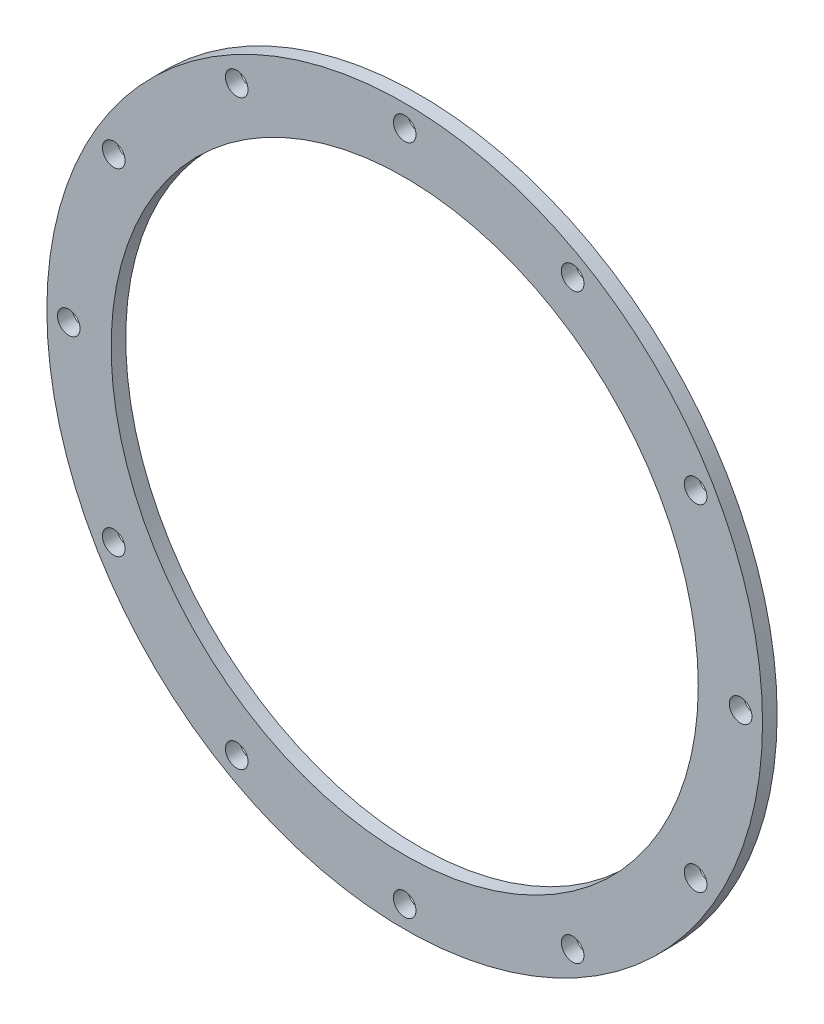
ISO-10303-21;
HEADER;
FILE_DESCRIPTION(('STEP AP214'),'2;1');
FILE_NAME('part.step','',(''),(''),'','','');
FILE_SCHEMA(('AUTOMOTIVE_DESIGN { 1 0 10303 214 1 1 1 1 }'));
ENDSEC;
DATA;
#1=APPLICATION_CONTEXT('core data for automotive mechanical design processes');
#2=APPLICATION_PROTOCOL_DEFINITION('international standard','automotive_design',2000,#1);
#3=PRODUCT_CONTEXT('',#1,'mechanical');
#4=PRODUCT('Part','Part','',(#3));
#5=PRODUCT_RELATED_PRODUCT_CATEGORY('part','',(#4));
#6=PRODUCT_DEFINITION_FORMATION('','',#4);
#7=PRODUCT_DEFINITION_CONTEXT('part definition',#1,'design');
#8=PRODUCT_DEFINITION('design','',#6,#7);
#9=PRODUCT_DEFINITION_SHAPE('','',#8);
#10=(LENGTH_UNIT() NAMED_UNIT(*) SI_UNIT(.MILLI.,.METRE.));
#11=(NAMED_UNIT(*) PLANE_ANGLE_UNIT() SI_UNIT($,.RADIAN.));
#12=(NAMED_UNIT(*) SI_UNIT($,.STERADIAN.) SOLID_ANGLE_UNIT());
#13=UNCERTAINTY_MEASURE_WITH_UNIT(LENGTH_MEASURE(1.E-05),#10,'distance_accuracy_value','');
#14=(GEOMETRIC_REPRESENTATION_CONTEXT(3) GLOBAL_UNCERTAINTY_ASSIGNED_CONTEXT((#13)) GLOBAL_UNIT_ASSIGNED_CONTEXT((#10,
#11,#12)) REPRESENTATION_CONTEXT('',''));
#15=CARTESIAN_POINT('',(0.,0.,0.));
#16=DIRECTION('',(0.,0.,1.));
#17=DIRECTION('',(1.,0.,0.));
#18=AXIS2_PLACEMENT_3D('',#15,#16,#17);
#19=CARTESIAN_POINT('',(0.,0.,2.));
#20=DIRECTION('',(0.,0.,1.));
#21=DIRECTION('',(1.,0.,0.));
#22=AXIS2_PLACEMENT_3D('',#19,#20,#21);
#23=PLANE('',#22);
#24=CARTESIAN_POINT('',(-39.8371685740822,23.0000000000035,2.));
#25=DIRECTION('',(0.,0.,1.));
#26=DIRECTION('',(1.,0.,0.));
#27=AXIS2_PLACEMENT_3D('',#24,#25,#26);
#28=CIRCLE('',#27,1.55);
#29=CARTESIAN_POINT('',(-38.2871685740822,23.0000000000035,2.));
#30=VERTEX_POINT('',#29);
#31=EDGE_CURVE('E110',#30,#30,#28,.T.);
#32=ORIENTED_EDGE('',*,*,#31,.F.);
#33=EDGE_LOOP('',(#32));
#34=FACE_BOUND('',#33,.T.);
#35=CARTESIAN_POINT('',(-39.8371685740858,-22.9999999999972,2.));
#36=DIRECTION('',(0.,0.,1.));
#37=DIRECTION('',(1.,0.,0.));
#38=AXIS2_PLACEMENT_3D('',#35,#36,#37);
#39=CIRCLE('',#38,1.54999999999999);
#40=CARTESIAN_POINT('',(-38.2871685740858,-22.9999999999972,2.));
#41=VERTEX_POINT('',#40);
#42=EDGE_CURVE('E98',#41,#41,#39,.T.);
#43=ORIENTED_EDGE('',*,*,#42,.F.);
#44=EDGE_LOOP('',(#43));
#45=FACE_BOUND('',#44,.T.);
#46=CARTESIAN_POINT('',(-2.44549283010593E-12,-46.,2.));
#47=DIRECTION('',(0.,0.,1.));
#48=DIRECTION('',(1.,0.,0.));
#49=AXIS2_PLACEMENT_3D('',#46,#47,#48);
#50=CIRCLE('',#49,1.55);
#51=CARTESIAN_POINT('',(1.54999999999756,-46.,2.));
#52=VERTEX_POINT('',#51);
#53=EDGE_CURVE('E86',#52,#52,#50,.T.);
#54=ORIENTED_EDGE('',*,*,#53,.F.);
#55=EDGE_LOOP('',(#54));
#56=FACE_BOUND('',#55,.T.);
#57=CARTESIAN_POINT('',(39.8371685740834,-23.0000000000014,2.));
#58=DIRECTION('',(0.,0.,1.));
#59=DIRECTION('',(1.,0.,0.));
#60=AXIS2_PLACEMENT_3D('',#57,#58,#59);
#61=CIRCLE('',#60,1.55);
#62=CARTESIAN_POINT('',(41.3871685740834,-23.0000000000014,2.));
#63=VERTEX_POINT('',#62);
#64=EDGE_CURVE('E74',#63,#63,#61,.T.);
#65=ORIENTED_EDGE('',*,*,#64,.F.);
#66=EDGE_LOOP('',(#65));
#67=FACE_BOUND('',#66,.T.);
#68=CARTESIAN_POINT('',(39.8371685740846,22.9999999999993,2.));
#69=DIRECTION('',(0.,0.,1.));
#70=DIRECTION('',(1.,0.,0.));
#71=AXIS2_PLACEMENT_3D('',#68,#69,#70);
#72=CIRCLE('',#71,1.55);
#73=CARTESIAN_POINT('',(41.3871685740846,22.9999999999993,2.));
#74=VERTEX_POINT('',#73);
#75=EDGE_CURVE('E62',#74,#74,#72,.T.);
#76=ORIENTED_EDGE('',*,*,#75,.F.);
#77=EDGE_LOOP('',(#76));
#78=FACE_BOUND('',#77,.T.);
#79=CARTESIAN_POINT('',(0.,46.,2.));
#80=DIRECTION('',(0.,0.,1.));
#81=DIRECTION('',(1.,0.,0.));
#82=AXIS2_PLACEMENT_3D('',#79,#80,#81);
#83=CIRCLE('',#82,1.55);
#84=CARTESIAN_POINT('',(1.55,46.,2.));
#85=VERTEX_POINT('',#84);
#86=EDGE_CURVE('E50',#85,#85,#83,.T.);
#87=ORIENTED_EDGE('',*,*,#86,.F.);
#88=EDGE_LOOP('',(#87));
#89=FACE_BOUND('',#88,.T.);
#90=CARTESIAN_POINT('',(0.,0.,2.));
#91=DIRECTION('',(0.,0.,1.));
#92=DIRECTION('',(1.,0.,0.));
#93=AXIS2_PLACEMENT_3D('',#90,#91,#92);
#94=CIRCLE('',#93,49.);
#95=CARTESIAN_POINT('',(49.,0.,2.));
#96=VERTEX_POINT('',#95);
#97=EDGE_CURVE('E10',#96,#96,#94,.T.);
#98=ORIENTED_EDGE('',*,*,#97,.T.);
#99=EDGE_LOOP('',(#98));
#100=FACE_BOUND('',#99,.T.);
#101=CARTESIAN_POINT('',(0.,0.,2.));
#102=DIRECTION('',(0.,0.,1.));
#103=DIRECTION('',(1.,0.,0.));
#104=AXIS2_PLACEMENT_3D('',#101,#102,#103);
#105=CIRCLE('',#104,40.2);
#106=CARTESIAN_POINT('',(40.2,0.,2.));
#107=VERTEX_POINT('',#106);
#108=EDGE_CURVE('E45',#107,#107,#105,.T.);
#109=ORIENTED_EDGE('',*,*,#108,.F.);
#110=EDGE_LOOP('',(#109));
#111=FACE_BOUND('',#110,.T.);
#112=CARTESIAN_POINT('',(23.0000000000004,39.837168574084,2.));
#113=DIRECTION('',(0.,0.,1.));
#114=DIRECTION('',(1.,0.,0.));
#115=AXIS2_PLACEMENT_3D('',#112,#113,#114);
#116=CIRCLE('',#115,1.55);
#117=CARTESIAN_POINT('',(24.5500000000004,39.837168574084,2.));
#118=VERTEX_POINT('',#117);
#119=EDGE_CURVE('E56',#118,#118,#116,.T.);
#120=ORIENTED_EDGE('',*,*,#119,.F.);
#121=EDGE_LOOP('',(#120));
#122=FACE_BOUND('',#121,.T.);
#123=CARTESIAN_POINT('',(46.,-1.22298005056365E-12,2.));
#124=DIRECTION('',(0.,0.,1.));
#125=DIRECTION('',(1.,0.,0.));
#126=AXIS2_PLACEMENT_3D('',#123,#124,#125);
#127=CIRCLE('',#126,1.55);
#128=CARTESIAN_POINT('',(47.55,-1.22298005056365E-12,2.));
#129=VERTEX_POINT('',#128);
#130=EDGE_CURVE('E68',#129,#129,#127,.T.);
#131=ORIENTED_EDGE('',*,*,#130,.F.);
#132=EDGE_LOOP('',(#131));
#133=FACE_BOUND('',#132,.T.);
#134=CARTESIAN_POINT('',(22.9999999999982,-39.8371685740852,2.));
#135=DIRECTION('',(0.,0.,1.));
#136=DIRECTION('',(1.,0.,0.));
#137=AXIS2_PLACEMENT_3D('',#134,#135,#136);
#138=CIRCLE('',#137,1.55);
#139=CARTESIAN_POINT('',(24.5499999999982,-39.8371685740852,2.));
#140=VERTEX_POINT('',#139);
#141=EDGE_CURVE('E80',#140,#140,#138,.T.);
#142=ORIENTED_EDGE('',*,*,#141,.F.);
#143=EDGE_LOOP('',(#142));
#144=FACE_BOUND('',#143,.T.);
#145=CARTESIAN_POINT('',(-23.0000000000025,-39.8371685740828,2.));
#146=DIRECTION('',(0.,0.,1.));
#147=DIRECTION('',(1.,0.,0.));
#148=AXIS2_PLACEMENT_3D('',#145,#146,#147);
#149=CIRCLE('',#148,1.55);
#150=CARTESIAN_POINT('',(-21.4500000000025,-39.8371685740828,2.));
#151=VERTEX_POINT('',#150);
#152=EDGE_CURVE('E92',#151,#151,#149,.T.);
#153=ORIENTED_EDGE('',*,*,#152,.F.);
#154=EDGE_LOOP('',(#153));
#155=FACE_BOUND('',#154,.T.);
#156=CARTESIAN_POINT('',(-46.,3.66894015169095E-12,2.));
#157=DIRECTION('',(0.,0.,1.));
#158=DIRECTION('',(1.,0.,0.));
#159=AXIS2_PLACEMENT_3D('',#156,#157,#158);
#160=CIRCLE('',#159,1.55);
#161=CARTESIAN_POINT('',(-44.45,3.66894015169095E-12,2.));
#162=VERTEX_POINT('',#161);
#163=EDGE_CURVE('E104',#162,#162,#160,.T.);
#164=ORIENTED_EDGE('',*,*,#163,.F.);
#165=EDGE_LOOP('',(#164));
#166=FACE_BOUND('',#165,.T.);
#167=CARTESIAN_POINT('',(-22.9999999999961,39.8371685740864,2.));
#168=DIRECTION('',(0.,0.,1.));
#169=DIRECTION('',(1.,0.,0.));
#170=AXIS2_PLACEMENT_3D('',#167,#168,#169);
#171=CIRCLE('',#170,1.55);
#172=CARTESIAN_POINT('',(-21.4499999999961,39.8371685740864,2.));
#173=VERTEX_POINT('',#172);
#174=EDGE_CURVE('E116',#173,#173,#171,.T.);
#175=ORIENTED_EDGE('',*,*,#174,.F.);
#176=EDGE_LOOP('',(#175));
#177=FACE_BOUND('',#176,.T.);
#178=ADVANCED_FACE('F34',(#34,#45,#56,#67,#78,#89,#100,#111,#122,#133,#144,#155,#166,#177),#23,.T.);
#179=CARTESIAN_POINT('',(0.,0.,0.));
#180=DIRECTION('',(0.,0.,1.));
#181=DIRECTION('',(1.,0.,0.));
#182=AXIS2_PLACEMENT_3D('',#179,#180,#181);
#183=PLANE('',#182);
#184=CARTESIAN_POINT('',(0.,0.,0.));
#185=DIRECTION('',(0.,0.,1.));
#186=DIRECTION('',(1.,0.,0.));
#187=AXIS2_PLACEMENT_3D('',#184,#185,#186);
#188=CIRCLE('',#187,49.);
#189=CARTESIAN_POINT('',(49.,0.,0.));
#190=VERTEX_POINT('',#189);
#191=EDGE_CURVE('E38',#190,#190,#188,.T.);
#192=ORIENTED_EDGE('',*,*,#191,.F.);
#193=EDGE_LOOP('',(#192));
#194=FACE_BOUND('',#193,.T.);
#195=CARTESIAN_POINT('',(0.,0.,0.));
#196=DIRECTION('',(0.,0.,1.));
#197=DIRECTION('',(1.,0.,0.));
#198=AXIS2_PLACEMENT_3D('',#195,#196,#197);
#199=CIRCLE('',#198,40.2);
#200=CARTESIAN_POINT('',(40.2,0.,0.));
#201=VERTEX_POINT('',#200);
#202=EDGE_CURVE('E47',#201,#201,#199,.T.);
#203=ORIENTED_EDGE('',*,*,#202,.T.);
#204=EDGE_LOOP('',(#203));
#205=FACE_BOUND('',#204,.T.);
#206=CARTESIAN_POINT('',(0.,46.,0.));
#207=DIRECTION('',(0.,0.,1.));
#208=DIRECTION('',(1.,0.,0.));
#209=AXIS2_PLACEMENT_3D('',#206,#207,#208);
#210=CIRCLE('',#209,1.55);
#211=CARTESIAN_POINT('',(1.55,46.,0.));
#212=VERTEX_POINT('',#211);
#213=EDGE_CURVE('E53',#212,#212,#210,.T.);
#214=ORIENTED_EDGE('',*,*,#213,.T.);
#215=EDGE_LOOP('',(#214));
#216=FACE_BOUND('',#215,.T.);
#217=CARTESIAN_POINT('',(23.0000000000004,39.837168574084,0.));
#218=DIRECTION('',(0.,0.,1.));
#219=DIRECTION('',(1.,0.,0.));
#220=AXIS2_PLACEMENT_3D('',#217,#218,#219);
#221=CIRCLE('',#220,1.55);
#222=CARTESIAN_POINT('',(24.5500000000004,39.837168574084,0.));
#223=VERTEX_POINT('',#222);
#224=EDGE_CURVE('E59',#223,#223,#221,.T.);
#225=ORIENTED_EDGE('',*,*,#224,.T.);
#226=EDGE_LOOP('',(#225));
#227=FACE_BOUND('',#226,.T.);
#228=CARTESIAN_POINT('',(39.8371685740846,22.9999999999993,0.));
#229=DIRECTION('',(0.,0.,1.));
#230=DIRECTION('',(1.,0.,0.));
#231=AXIS2_PLACEMENT_3D('',#228,#229,#230);
#232=CIRCLE('',#231,1.55);
#233=CARTESIAN_POINT('',(41.3871685740846,22.9999999999993,0.));
#234=VERTEX_POINT('',#233);
#235=EDGE_CURVE('E65',#234,#234,#232,.T.);
#236=ORIENTED_EDGE('',*,*,#235,.T.);
#237=EDGE_LOOP('',(#236));
#238=FACE_BOUND('',#237,.T.);
#239=CARTESIAN_POINT('',(46.,-1.22298005056365E-12,0.));
#240=DIRECTION('',(0.,0.,1.));
#241=DIRECTION('',(1.,0.,0.));
#242=AXIS2_PLACEMENT_3D('',#239,#240,#241);
#243=CIRCLE('',#242,1.55);
#244=CARTESIAN_POINT('',(47.55,-1.22298005056365E-12,0.));
#245=VERTEX_POINT('',#244);
#246=EDGE_CURVE('E71',#245,#245,#243,.T.);
#247=ORIENTED_EDGE('',*,*,#246,.T.);
#248=EDGE_LOOP('',(#247));
#249=FACE_BOUND('',#248,.T.);
#250=CARTESIAN_POINT('',(39.8371685740834,-23.0000000000014,0.));
#251=DIRECTION('',(0.,0.,1.));
#252=DIRECTION('',(1.,0.,0.));
#253=AXIS2_PLACEMENT_3D('',#250,#251,#252);
#254=CIRCLE('',#253,1.55);
#255=CARTESIAN_POINT('',(41.3871685740834,-23.0000000000014,0.));
#256=VERTEX_POINT('',#255);
#257=EDGE_CURVE('E77',#256,#256,#254,.T.);
#258=ORIENTED_EDGE('',*,*,#257,.T.);
#259=EDGE_LOOP('',(#258));
#260=FACE_BOUND('',#259,.T.);
#261=CARTESIAN_POINT('',(22.9999999999982,-39.8371685740852,0.));
#262=DIRECTION('',(0.,0.,1.));
#263=DIRECTION('',(1.,0.,0.));
#264=AXIS2_PLACEMENT_3D('',#261,#262,#263);
#265=CIRCLE('',#264,1.55);
#266=CARTESIAN_POINT('',(24.5499999999982,-39.8371685740852,0.));
#267=VERTEX_POINT('',#266);
#268=EDGE_CURVE('E83',#267,#267,#265,.T.);
#269=ORIENTED_EDGE('',*,*,#268,.T.);
#270=EDGE_LOOP('',(#269));
#271=FACE_BOUND('',#270,.T.);
#272=CARTESIAN_POINT('',(-2.44549283010593E-12,-46.,0.));
#273=DIRECTION('',(0.,0.,1.));
#274=DIRECTION('',(1.,0.,0.));
#275=AXIS2_PLACEMENT_3D('',#272,#273,#274);
#276=CIRCLE('',#275,1.55);
#277=CARTESIAN_POINT('',(1.54999999999756,-46.,0.));
#278=VERTEX_POINT('',#277);
#279=EDGE_CURVE('E89',#278,#278,#276,.T.);
#280=ORIENTED_EDGE('',*,*,#279,.T.);
#281=EDGE_LOOP('',(#280));
#282=FACE_BOUND('',#281,.T.);
#283=CARTESIAN_POINT('',(-23.0000000000025,-39.8371685740828,0.));
#284=DIRECTION('',(0.,0.,1.));
#285=DIRECTION('',(1.,0.,0.));
#286=AXIS2_PLACEMENT_3D('',#283,#284,#285);
#287=CIRCLE('',#286,1.55);
#288=CARTESIAN_POINT('',(-21.4500000000025,-39.8371685740828,0.));
#289=VERTEX_POINT('',#288);
#290=EDGE_CURVE('E95',#289,#289,#287,.T.);
#291=ORIENTED_EDGE('',*,*,#290,.T.);
#292=EDGE_LOOP('',(#291));
#293=FACE_BOUND('',#292,.T.);
#294=CARTESIAN_POINT('',(-39.8371685740858,-22.9999999999972,0.));
#295=DIRECTION('',(0.,0.,1.));
#296=DIRECTION('',(1.,0.,0.));
#297=AXIS2_PLACEMENT_3D('',#294,#295,#296);
#298=CIRCLE('',#297,1.54999999999999);
#299=CARTESIAN_POINT('',(-38.2871685740858,-22.9999999999972,0.));
#300=VERTEX_POINT('',#299);
#301=EDGE_CURVE('E101',#300,#300,#298,.T.);
#302=ORIENTED_EDGE('',*,*,#301,.T.);
#303=EDGE_LOOP('',(#302));
#304=FACE_BOUND('',#303,.T.);
#305=CARTESIAN_POINT('',(-46.,3.66894015169095E-12,0.));
#306=DIRECTION('',(0.,0.,1.));
#307=DIRECTION('',(1.,0.,0.));
#308=AXIS2_PLACEMENT_3D('',#305,#306,#307);
#309=CIRCLE('',#308,1.55);
#310=CARTESIAN_POINT('',(-44.45,3.66894015169095E-12,0.));
#311=VERTEX_POINT('',#310);
#312=EDGE_CURVE('E107',#311,#311,#309,.T.);
#313=ORIENTED_EDGE('',*,*,#312,.T.);
#314=EDGE_LOOP('',(#313));
#315=FACE_BOUND('',#314,.T.);
#316=CARTESIAN_POINT('',(-39.8371685740822,23.0000000000035,0.));
#317=DIRECTION('',(0.,0.,1.));
#318=DIRECTION('',(1.,0.,0.));
#319=AXIS2_PLACEMENT_3D('',#316,#317,#318);
#320=CIRCLE('',#319,1.55);
#321=CARTESIAN_POINT('',(-38.2871685740822,23.0000000000035,0.));
#322=VERTEX_POINT('',#321);
#323=EDGE_CURVE('E113',#322,#322,#320,.T.);
#324=ORIENTED_EDGE('',*,*,#323,.T.);
#325=EDGE_LOOP('',(#324));
#326=FACE_BOUND('',#325,.T.);
#327=CARTESIAN_POINT('',(-22.9999999999961,39.8371685740864,0.));
#328=DIRECTION('',(0.,0.,1.));
#329=DIRECTION('',(1.,0.,0.));
#330=AXIS2_PLACEMENT_3D('',#327,#328,#329);
#331=CIRCLE('',#330,1.55);
#332=CARTESIAN_POINT('',(-21.4499999999961,39.8371685740864,0.));
#333=VERTEX_POINT('',#332);
#334=EDGE_CURVE('E119',#333,#333,#331,.T.);
#335=ORIENTED_EDGE('',*,*,#334,.T.);
#336=EDGE_LOOP('',(#335));
#337=FACE_BOUND('',#336,.T.);
#338=ADVANCED_FACE('F129',(#194,#205,#216,#227,#238,#249,#260,#271,#282,#293,#304,#315,#326,
#337),#183,.F.);
#339=CARTESIAN_POINT('',(0.,0.,2.));
#340=DIRECTION('',(0.,0.,-1.));
#341=DIRECTION('',(-1.,0.,0.));
#342=AXIS2_PLACEMENT_3D('',#339,#340,#341);
#343=CYLINDRICAL_SURFACE('',#342,49.);
#344=ORIENTED_EDGE('',*,*,#97,.F.);
#345=EDGE_LOOP('',(#344));
#346=FACE_BOUND('',#345,.T.);
#347=ORIENTED_EDGE('',*,*,#191,.T.);
#348=EDGE_LOOP('',(#347));
#349=FACE_BOUND('',#348,.T.);
#350=ADVANCED_FACE('F36',(#346,#349),#343,.T.);
#351=CARTESIAN_POINT('',(0.,0.,2.));
#352=DIRECTION('',(0.,0.,-1.));
#353=DIRECTION('',(-1.,0.,0.));
#354=AXIS2_PLACEMENT_3D('',#351,#352,#353);
#355=CYLINDRICAL_SURFACE('',#354,40.2);
#356=ORIENTED_EDGE('',*,*,#108,.T.);
#357=EDGE_LOOP('',(#356));
#358=FACE_BOUND('',#357,.T.);
#359=ORIENTED_EDGE('',*,*,#202,.F.);
#360=EDGE_LOOP('',(#359));
#361=FACE_BOUND('',#360,.T.);
#362=ADVANCED_FACE('F139',(#358,#361),#355,.F.);
#363=CARTESIAN_POINT('',(0.,46.,2.));
#364=DIRECTION('',(0.,0.,-1.));
#365=DIRECTION('',(-1.,0.,0.));
#366=AXIS2_PLACEMENT_3D('',#363,#364,#365);
#367=CYLINDRICAL_SURFACE('',#366,1.55);
#368=ORIENTED_EDGE('',*,*,#86,.T.);
#369=EDGE_LOOP('',(#368));
#370=FACE_BOUND('',#369,.T.);
#371=ORIENTED_EDGE('',*,*,#213,.F.);
#372=EDGE_LOOP('',(#371));
#373=FACE_BOUND('',#372,.T.);
#374=ADVANCED_FACE('F142',(#370,#373),#367,.F.);
#375=CARTESIAN_POINT('',(23.0000000000004,39.837168574084,2.));
#376=DIRECTION('',(0.,0.,-1.));
#377=DIRECTION('',(-1.,0.,0.));
#378=AXIS2_PLACEMENT_3D('',#375,#376,#377);
#379=CYLINDRICAL_SURFACE('',#378,1.55);
#380=ORIENTED_EDGE('',*,*,#119,.T.);
#381=EDGE_LOOP('',(#380));
#382=FACE_BOUND('',#381,.T.);
#383=ORIENTED_EDGE('',*,*,#224,.F.);
#384=EDGE_LOOP('',(#383));
#385=FACE_BOUND('',#384,.T.);
#386=ADVANCED_FACE('F146',(#382,#385),#379,.F.);
#387=CARTESIAN_POINT('',(39.8371685740846,22.9999999999993,2.));
#388=DIRECTION('',(0.,0.,-1.));
#389=DIRECTION('',(-1.,0.,0.));
#390=AXIS2_PLACEMENT_3D('',#387,#388,#389);
#391=CYLINDRICAL_SURFACE('',#390,1.55);
#392=ORIENTED_EDGE('',*,*,#75,.T.);
#393=EDGE_LOOP('',(#392));
#394=FACE_BOUND('',#393,.T.);
#395=ORIENTED_EDGE('',*,*,#235,.F.);
#396=EDGE_LOOP('',(#395));
#397=FACE_BOUND('',#396,.T.);
#398=ADVANCED_FACE('F150',(#394,#397),#391,.F.);
#399=CARTESIAN_POINT('',(46.,-1.22298005056365E-12,2.));
#400=DIRECTION('',(0.,0.,-1.));
#401=DIRECTION('',(-1.,0.,0.));
#402=AXIS2_PLACEMENT_3D('',#399,#400,#401);
#403=CYLINDRICAL_SURFACE('',#402,1.55);
#404=ORIENTED_EDGE('',*,*,#130,.T.);
#405=EDGE_LOOP('',(#404));
#406=FACE_BOUND('',#405,.T.);
#407=ORIENTED_EDGE('',*,*,#246,.F.);
#408=EDGE_LOOP('',(#407));
#409=FACE_BOUND('',#408,.T.);
#410=ADVANCED_FACE('F154',(#406,#409),#403,.F.);
#411=CARTESIAN_POINT('',(39.8371685740834,-23.0000000000014,2.));
#412=DIRECTION('',(0.,0.,-1.));
#413=DIRECTION('',(-1.,0.,0.));
#414=AXIS2_PLACEMENT_3D('',#411,#412,#413);
#415=CYLINDRICAL_SURFACE('',#414,1.55);
#416=ORIENTED_EDGE('',*,*,#64,.T.);
#417=EDGE_LOOP('',(#416));
#418=FACE_BOUND('',#417,.T.);
#419=ORIENTED_EDGE('',*,*,#257,.F.);
#420=EDGE_LOOP('',(#419));
#421=FACE_BOUND('',#420,.T.);
#422=ADVANCED_FACE('F158',(#418,#421),#415,.F.);
#423=CARTESIAN_POINT('',(22.9999999999982,-39.8371685740852,2.));
#424=DIRECTION('',(0.,0.,-1.));
#425=DIRECTION('',(-1.,0.,0.));
#426=AXIS2_PLACEMENT_3D('',#423,#424,#425);
#427=CYLINDRICAL_SURFACE('',#426,1.55);
#428=ORIENTED_EDGE('',*,*,#141,.T.);
#429=EDGE_LOOP('',(#428));
#430=FACE_BOUND('',#429,.T.);
#431=ORIENTED_EDGE('',*,*,#268,.F.);
#432=EDGE_LOOP('',(#431));
#433=FACE_BOUND('',#432,.T.);
#434=ADVANCED_FACE('F162',(#430,#433),#427,.F.);
#435=CARTESIAN_POINT('',(-2.44549283010593E-12,-46.,2.));
#436=DIRECTION('',(0.,0.,-1.));
#437=DIRECTION('',(-1.,0.,0.));
#438=AXIS2_PLACEMENT_3D('',#435,#436,#437);
#439=CYLINDRICAL_SURFACE('',#438,1.55);
#440=ORIENTED_EDGE('',*,*,#53,.T.);
#441=EDGE_LOOP('',(#440));
#442=FACE_BOUND('',#441,.T.);
#443=ORIENTED_EDGE('',*,*,#279,.F.);
#444=EDGE_LOOP('',(#443));
#445=FACE_BOUND('',#444,.T.);
#446=ADVANCED_FACE('F166',(#442,#445),#439,.F.);
#447=CARTESIAN_POINT('',(-23.0000000000025,-39.8371685740828,2.));
#448=DIRECTION('',(0.,0.,-1.));
#449=DIRECTION('',(-1.,0.,0.));
#450=AXIS2_PLACEMENT_3D('',#447,#448,#449);
#451=CYLINDRICAL_SURFACE('',#450,1.55);
#452=ORIENTED_EDGE('',*,*,#152,.T.);
#453=EDGE_LOOP('',(#452));
#454=FACE_BOUND('',#453,.T.);
#455=ORIENTED_EDGE('',*,*,#290,.F.);
#456=EDGE_LOOP('',(#455));
#457=FACE_BOUND('',#456,.T.);
#458=ADVANCED_FACE('F170',(#454,#457),#451,.F.);
#459=CARTESIAN_POINT('',(-39.8371685740858,-22.9999999999972,2.));
#460=DIRECTION('',(0.,0.,-1.));
#461=DIRECTION('',(-1.,0.,0.));
#462=AXIS2_PLACEMENT_3D('',#459,#460,#461);
#463=CYLINDRICAL_SURFACE('',#462,1.54999999999999);
#464=ORIENTED_EDGE('',*,*,#42,.T.);
#465=EDGE_LOOP('',(#464));
#466=FACE_BOUND('',#465,.T.);
#467=ORIENTED_EDGE('',*,*,#301,.F.);
#468=EDGE_LOOP('',(#467));
#469=FACE_BOUND('',#468,.T.);
#470=ADVANCED_FACE('F174',(#466,#469),#463,.F.);
#471=CARTESIAN_POINT('',(-46.,3.66894015169095E-12,2.));
#472=DIRECTION('',(0.,0.,-1.));
#473=DIRECTION('',(-1.,0.,0.));
#474=AXIS2_PLACEMENT_3D('',#471,#472,#473);
#475=CYLINDRICAL_SURFACE('',#474,1.55);
#476=ORIENTED_EDGE('',*,*,#163,.T.);
#477=EDGE_LOOP('',(#476));
#478=FACE_BOUND('',#477,.T.);
#479=ORIENTED_EDGE('',*,*,#312,.F.);
#480=EDGE_LOOP('',(#479));
#481=FACE_BOUND('',#480,.T.);
#482=ADVANCED_FACE('F178',(#478,#481),#475,.F.);
#483=CARTESIAN_POINT('',(-39.8371685740822,23.0000000000035,2.));
#484=DIRECTION('',(0.,0.,-1.));
#485=DIRECTION('',(-1.,0.,0.));
#486=AXIS2_PLACEMENT_3D('',#483,#484,#485);
#487=CYLINDRICAL_SURFACE('',#486,1.55);
#488=ORIENTED_EDGE('',*,*,#31,.T.);
#489=EDGE_LOOP('',(#488));
#490=FACE_BOUND('',#489,.T.);
#491=ORIENTED_EDGE('',*,*,#323,.F.);
#492=EDGE_LOOP('',(#491));
#493=FACE_BOUND('',#492,.T.);
#494=ADVANCED_FACE('F182',(#490,#493),#487,.F.);
#495=CARTESIAN_POINT('',(-22.9999999999961,39.8371685740864,2.));
#496=DIRECTION('',(0.,0.,-1.));
#497=DIRECTION('',(-1.,0.,0.));
#498=AXIS2_PLACEMENT_3D('',#495,#496,#497);
#499=CYLINDRICAL_SURFACE('',#498,1.55);
#500=ORIENTED_EDGE('',*,*,#174,.T.);
#501=EDGE_LOOP('',(#500));
#502=FACE_BOUND('',#501,.T.);
#503=ORIENTED_EDGE('',*,*,#334,.F.);
#504=EDGE_LOOP('',(#503));
#505=FACE_BOUND('',#504,.T.);
#506=ADVANCED_FACE('F125',(#502,#505),#499,.F.);
#507=CLOSED_SHELL('',(#178,#338,#350,#362,#374,#386,#398,#410,#422,#434,#446,#458,#470,#482,
#494,#506));
#508=MANIFOLD_SOLID_BREP('B2',#507);
#509=ADVANCED_BREP_SHAPE_REPRESENTATION('',(#18,#508),#14);
#510=SHAPE_DEFINITION_REPRESENTATION(#9,#509);
ENDSEC;
END-ISO-10303-21;
